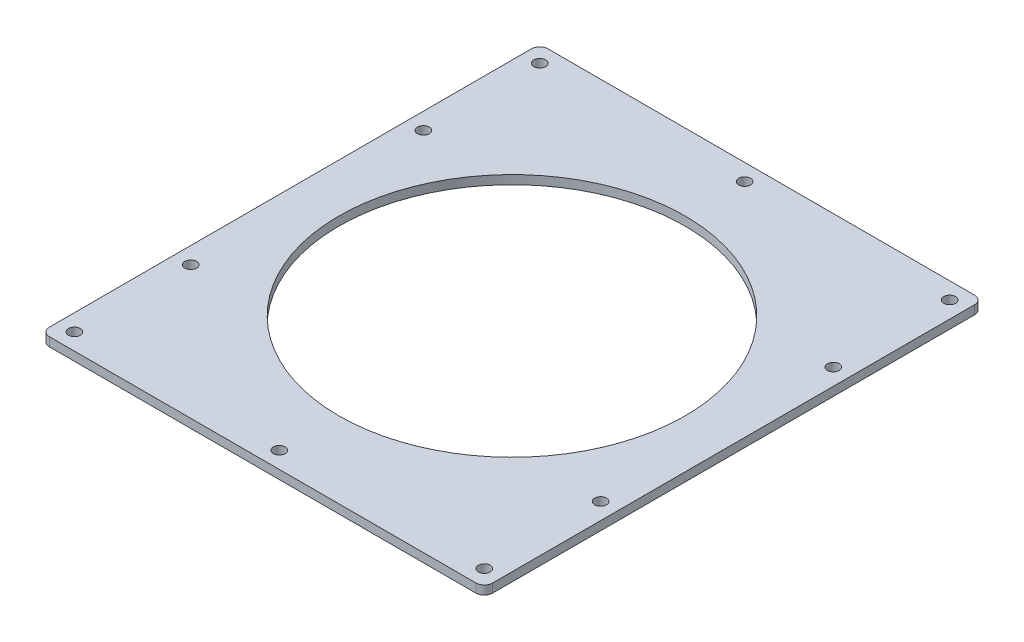
ISO-10303-21;
HEADER;
FILE_DESCRIPTION(('STEP AP214'),'2;1');
FILE_NAME('part.step','',(''),(''),'','','');
FILE_SCHEMA(('AUTOMOTIVE_DESIGN { 1 0 10303 214 1 1 1 1 }'));
ENDSEC;
DATA;
#1=APPLICATION_CONTEXT('core data for automotive mechanical design processes');
#2=APPLICATION_PROTOCOL_DEFINITION('international standard','automotive_design',2000,#1);
#3=PRODUCT_CONTEXT('',#1,'mechanical');
#4=PRODUCT('Part','Part','',(#3));
#5=PRODUCT_RELATED_PRODUCT_CATEGORY('part','',(#4));
#6=PRODUCT_DEFINITION_FORMATION('','',#4);
#7=PRODUCT_DEFINITION_CONTEXT('part definition',#1,'design');
#8=PRODUCT_DEFINITION('design','',#6,#7);
#9=PRODUCT_DEFINITION_SHAPE('','',#8);
#10=(LENGTH_UNIT() NAMED_UNIT(*) SI_UNIT(.MILLI.,.METRE.));
#11=(NAMED_UNIT(*) PLANE_ANGLE_UNIT() SI_UNIT($,.RADIAN.));
#12=(NAMED_UNIT(*) SI_UNIT($,.STERADIAN.) SOLID_ANGLE_UNIT());
#13=UNCERTAINTY_MEASURE_WITH_UNIT(LENGTH_MEASURE(1.E-05),#10,'distance_accuracy_value','');
#14=(GEOMETRIC_REPRESENTATION_CONTEXT(3) GLOBAL_UNCERTAINTY_ASSIGNED_CONTEXT((#13)) GLOBAL_UNIT_ASSIGNED_CONTEXT((#10,
#11,#12)) REPRESENTATION_CONTEXT('',''));
#15=CARTESIAN_POINT('',(0.,0.,0.));
#16=DIRECTION('',(0.,0.,1.));
#17=DIRECTION('',(1.,0.,0.));
#18=AXIS2_PLACEMENT_3D('',#15,#16,#17);
#19=CARTESIAN_POINT('',(0.,3.175,0.));
#20=DIRECTION('',(0.,-1.,0.));
#21=DIRECTION('',(0.,0.,-1.));
#22=AXIS2_PLACEMENT_3D('',#19,#20,#21);
#23=PLANE('',#22);
#24=DIRECTION('',(-1.,0.,0.));
#25=VECTOR('',#24,1.);
#26=CARTESIAN_POINT('',(-80.,3.175,-90.));
#27=LINE('',#26,#25);
#28=CARTESIAN_POINT('',(77.,3.175,-90.));
#29=VERTEX_POINT('',#28);
#30=CARTESIAN_POINT('',(-77.,3.175,-90.));
#31=VERTEX_POINT('',#30);
#32=EDGE_CURVE('E178',#29,#31,#27,.T.);
#33=ORIENTED_EDGE('',*,*,#32,.T.);
#34=CARTESIAN_POINT('',(-77.,3.175,-87.));
#35=DIRECTION('',(0.,-1.,0.));
#36=DIRECTION('',(0.,0.,-1.));
#37=AXIS2_PLACEMENT_3D('',#34,#35,#36);
#38=CIRCLE('',#37,3.);
#39=CARTESIAN_POINT('',(-80.,3.175,-86.9999999999999));
#40=VERTEX_POINT('',#39);
#41=EDGE_CURVE('E156',#31,#40,#38,.F.);
#42=ORIENTED_EDGE('',*,*,#41,.T.);
#43=DIRECTION('',(0.,0.,1.));
#44=VECTOR('',#43,1.);
#45=CARTESIAN_POINT('',(-80.,3.175,90.));
#46=LINE('',#45,#44);
#47=CARTESIAN_POINT('',(-80.,3.175,87.));
#48=VERTEX_POINT('',#47);
#49=EDGE_CURVE('E126',#40,#48,#46,.T.);
#50=ORIENTED_EDGE('',*,*,#49,.T.);
#51=CARTESIAN_POINT('',(-77.,3.175,87.));
#52=DIRECTION('',(0.,-1.,0.));
#53=DIRECTION('',(0.,0.,-1.));
#54=AXIS2_PLACEMENT_3D('',#51,#52,#53);
#55=CIRCLE('',#54,3.);
#56=CARTESIAN_POINT('',(-77.,3.175,90.));
#57=VERTEX_POINT('',#56);
#58=EDGE_CURVE('E62',#48,#57,#55,.F.);
#59=ORIENTED_EDGE('',*,*,#58,.T.);
#60=DIRECTION('',(1.,0.,0.));
#61=VECTOR('',#60,1.);
#62=CARTESIAN_POINT('',(-80.,3.175,90.));
#63=LINE('',#62,#61);
#64=CARTESIAN_POINT('',(77.,3.175,90.));
#65=VERTEX_POINT('',#64);
#66=EDGE_CURVE('E142',#57,#65,#63,.T.);
#67=ORIENTED_EDGE('',*,*,#66,.T.);
#68=CARTESIAN_POINT('',(77.,3.175,87.));
#69=DIRECTION('',(0.,-1.,0.));
#70=DIRECTION('',(0.,0.,-1.));
#71=AXIS2_PLACEMENT_3D('',#68,#69,#70);
#72=CIRCLE('',#71,3.);
#73=CARTESIAN_POINT('',(80.,3.175,87.));
#74=VERTEX_POINT('',#73);
#75=EDGE_CURVE('E154',#65,#74,#72,.F.);
#76=ORIENTED_EDGE('',*,*,#75,.T.);
#77=DIRECTION('',(0.,0.,-1.));
#78=VECTOR('',#77,1.);
#79=CARTESIAN_POINT('',(80.,3.175,90.));
#80=LINE('',#79,#78);
#81=CARTESIAN_POINT('',(80.,3.175,-86.9999999999999));
#82=VERTEX_POINT('',#81);
#83=EDGE_CURVE('E136',#74,#82,#80,.T.);
#84=ORIENTED_EDGE('',*,*,#83,.T.);
#85=CARTESIAN_POINT('',(77.,3.175,-87.));
#86=DIRECTION('',(0.,-1.,0.));
#87=DIRECTION('',(0.,0.,-1.));
#88=AXIS2_PLACEMENT_3D('',#85,#86,#87);
#89=CIRCLE('',#88,3.);
#90=EDGE_CURVE('E152',#82,#29,#89,.F.);
#91=ORIENTED_EDGE('',*,*,#90,.T.);
#92=EDGE_LOOP('',(#33,#42,#50,#59,#67,#76,#84,#91));
#93=FACE_BOUND('',#92,.T.);
#94=CARTESIAN_POINT('',(0.,3.175,0.));
#95=DIRECTION('',(0.,1.,0.));
#96=DIRECTION('',(0.,0.,1.));
#97=AXIS2_PLACEMENT_3D('',#94,#95,#96);
#98=CIRCLE('',#97,62.5);
#99=CARTESIAN_POINT('',(0.,3.175,62.5));
#100=VERTEX_POINT('',#99);
#101=EDGE_CURVE('E187',#100,#100,#98,.T.);
#102=ORIENTED_EDGE('',*,*,#101,.F.);
#103=EDGE_LOOP('',(#102));
#104=FACE_BOUND('',#103,.T.);
#105=CARTESIAN_POINT('',(74.,3.175,-42.));
#106=DIRECTION('',(0.,1.,0.));
#107=DIRECTION('',(0.,0.,1.));
#108=AXIS2_PLACEMENT_3D('',#105,#106,#107);
#109=CIRCLE('',#108,2.125);
#110=CARTESIAN_POINT('',(74.,3.175,-39.875));
#111=VERTEX_POINT('',#110);
#112=EDGE_CURVE('E192',#111,#111,#109,.T.);
#113=ORIENTED_EDGE('',*,*,#112,.F.);
#114=EDGE_LOOP('',(#113));
#115=FACE_BOUND('',#114,.T.);
#116=CARTESIAN_POINT('',(-74.,3.175,84.));
#117=DIRECTION('',(0.,1.,0.));
#118=DIRECTION('',(0.,0.,1.));
#119=AXIS2_PLACEMENT_3D('',#116,#117,#118);
#120=CIRCLE('',#119,2.125);
#121=CARTESIAN_POINT('',(-74.,3.175,86.125));
#122=VERTEX_POINT('',#121);
#123=EDGE_CURVE('E197',#122,#122,#120,.T.);
#124=ORIENTED_EDGE('',*,*,#123,.F.);
#125=EDGE_LOOP('',(#124));
#126=FACE_BOUND('',#125,.T.);
#127=CARTESIAN_POINT('',(-74.,3.175,-42.));
#128=DIRECTION('',(0.,1.,0.));
#129=DIRECTION('',(0.,0.,-1.));
#130=AXIS2_PLACEMENT_3D('',#127,#128,#129);
#131=CIRCLE('',#130,2.125);
#132=CARTESIAN_POINT('',(-74.,3.175,-44.125));
#133=VERTEX_POINT('',#132);
#134=EDGE_CURVE('E203',#133,#133,#131,.T.);
#135=ORIENTED_EDGE('',*,*,#134,.F.);
#136=EDGE_LOOP('',(#135));
#137=FACE_BOUND('',#136,.T.);
#138=CARTESIAN_POINT('',(-74.,3.175,42.));
#139=DIRECTION('',(0.,1.,0.));
#140=DIRECTION('',(0.,0.,1.));
#141=AXIS2_PLACEMENT_3D('',#138,#139,#140);
#142=CIRCLE('',#141,2.125);
#143=CARTESIAN_POINT('',(-74.,3.175,44.125));
#144=VERTEX_POINT('',#143);
#145=EDGE_CURVE('E209',#144,#144,#142,.T.);
#146=ORIENTED_EDGE('',*,*,#145,.F.);
#147=EDGE_LOOP('',(#146));
#148=FACE_BOUND('',#147,.T.);
#149=CARTESIAN_POINT('',(-74.,3.175,-84.));
#150=DIRECTION('',(0.,1.,0.));
#151=DIRECTION('',(0.,0.,-1.));
#152=AXIS2_PLACEMENT_3D('',#149,#150,#151);
#153=CIRCLE('',#152,2.125);
#154=CARTESIAN_POINT('',(-74.,3.175,-86.125));
#155=VERTEX_POINT('',#154);
#156=EDGE_CURVE('E215',#155,#155,#153,.T.);
#157=ORIENTED_EDGE('',*,*,#156,.F.);
#158=EDGE_LOOP('',(#157));
#159=FACE_BOUND('',#158,.T.);
#160=CARTESIAN_POINT('',(74.,3.175,84.));
#161=DIRECTION('',(0.,1.,0.));
#162=DIRECTION('',(0.,0.,-1.));
#163=AXIS2_PLACEMENT_3D('',#160,#161,#162);
#164=CIRCLE('',#163,2.125);
#165=CARTESIAN_POINT('',(74.,3.175,81.875));
#166=VERTEX_POINT('',#165);
#167=EDGE_CURVE('E221',#166,#166,#164,.T.);
#168=ORIENTED_EDGE('',*,*,#167,.F.);
#169=EDGE_LOOP('',(#168));
#170=FACE_BOUND('',#169,.T.);
#171=CARTESIAN_POINT('',(74.,3.175,42.));
#172=DIRECTION('',(0.,1.,0.));
#173=DIRECTION('',(0.,0.,-1.));
#174=AXIS2_PLACEMENT_3D('',#171,#172,#173);
#175=CIRCLE('',#174,2.125);
#176=CARTESIAN_POINT('',(74.,3.175,39.875));
#177=VERTEX_POINT('',#176);
#178=EDGE_CURVE('E227',#177,#177,#175,.T.);
#179=ORIENTED_EDGE('',*,*,#178,.F.);
#180=EDGE_LOOP('',(#179));
#181=FACE_BOUND('',#180,.T.);
#182=CARTESIAN_POINT('',(74.,3.175,-84.));
#183=DIRECTION('',(0.,1.,0.));
#184=DIRECTION('',(0.,0.,1.));
#185=AXIS2_PLACEMENT_3D('',#182,#183,#184);
#186=CIRCLE('',#185,2.125);
#187=CARTESIAN_POINT('',(74.,3.175,-81.875));
#188=VERTEX_POINT('',#187);
#189=EDGE_CURVE('E233',#188,#188,#186,.T.);
#190=ORIENTED_EDGE('',*,*,#189,.F.);
#191=EDGE_LOOP('',(#190));
#192=FACE_BOUND('',#191,.T.);
#193=CARTESIAN_POINT('',(0.,3.175,84.));
#194=DIRECTION('',(0.,1.,0.));
#195=DIRECTION('',(0.,0.,1.));
#196=AXIS2_PLACEMENT_3D('',#193,#194,#195);
#197=CIRCLE('',#196,2.125);
#198=CARTESIAN_POINT('',(0.,3.175,86.125));
#199=VERTEX_POINT('',#198);
#200=EDGE_CURVE('E239',#199,#199,#197,.T.);
#201=ORIENTED_EDGE('',*,*,#200,.F.);
#202=EDGE_LOOP('',(#201));
#203=FACE_BOUND('',#202,.T.);
#204=CARTESIAN_POINT('',(0.,3.175,-84.));
#205=DIRECTION('',(0.,1.,0.));
#206=DIRECTION('',(0.,0.,-1.));
#207=AXIS2_PLACEMENT_3D('',#204,#205,#206);
#208=CIRCLE('',#207,2.125);
#209=CARTESIAN_POINT('',(0.,3.175,-86.125));
#210=VERTEX_POINT('',#209);
#211=EDGE_CURVE('E245',#210,#210,#208,.T.);
#212=ORIENTED_EDGE('',*,*,#211,.F.);
#213=EDGE_LOOP('',(#212));
#214=FACE_BOUND('',#213,.T.);
#215=ADVANCED_FACE('F42',(#93,#104,#115,#126,#137,#148,#159,#170,#181,#192,#203,#214),#23,.F.);
#216=CARTESIAN_POINT('',(0.,0.,0.));
#217=DIRECTION('',(0.,-1.,0.));
#218=DIRECTION('',(0.,0.,-1.));
#219=AXIS2_PLACEMENT_3D('',#216,#217,#218);
#220=PLANE('',#219);
#221=CARTESIAN_POINT('',(0.,0.,84.));
#222=DIRECTION('',(0.,1.,0.));
#223=DIRECTION('',(0.,0.,1.));
#224=AXIS2_PLACEMENT_3D('',#221,#222,#223);
#225=CIRCLE('',#224,2.125);
#226=CARTESIAN_POINT('',(0.,0.,86.125));
#227=VERTEX_POINT('',#226);
#228=EDGE_CURVE('E242',#227,#227,#225,.T.);
#229=ORIENTED_EDGE('',*,*,#228,.T.);
#230=EDGE_LOOP('',(#229));
#231=FACE_BOUND('',#230,.T.);
#232=CARTESIAN_POINT('',(74.,0.,42.));
#233=DIRECTION('',(0.,1.,0.));
#234=DIRECTION('',(0.,0.,-1.));
#235=AXIS2_PLACEMENT_3D('',#232,#233,#234);
#236=CIRCLE('',#235,2.125);
#237=CARTESIAN_POINT('',(74.,0.,39.875));
#238=VERTEX_POINT('',#237);
#239=EDGE_CURVE('E230',#238,#238,#236,.T.);
#240=ORIENTED_EDGE('',*,*,#239,.T.);
#241=EDGE_LOOP('',(#240));
#242=FACE_BOUND('',#241,.T.);
#243=CARTESIAN_POINT('',(-74.,0.,-84.));
#244=DIRECTION('',(0.,1.,0.));
#245=DIRECTION('',(0.,0.,-1.));
#246=AXIS2_PLACEMENT_3D('',#243,#244,#245);
#247=CIRCLE('',#246,2.125);
#248=CARTESIAN_POINT('',(-74.,0.,-86.125));
#249=VERTEX_POINT('',#248);
#250=EDGE_CURVE('E218',#249,#249,#247,.T.);
#251=ORIENTED_EDGE('',*,*,#250,.T.);
#252=EDGE_LOOP('',(#251));
#253=FACE_BOUND('',#252,.T.);
#254=CARTESIAN_POINT('',(-74.,0.,-42.));
#255=DIRECTION('',(0.,1.,0.));
#256=DIRECTION('',(0.,0.,-1.));
#257=AXIS2_PLACEMENT_3D('',#254,#255,#256);
#258=CIRCLE('',#257,2.125);
#259=CARTESIAN_POINT('',(-74.,0.,-44.125));
#260=VERTEX_POINT('',#259);
#261=EDGE_CURVE('E206',#260,#260,#258,.T.);
#262=ORIENTED_EDGE('',*,*,#261,.T.);
#263=EDGE_LOOP('',(#262));
#264=FACE_BOUND('',#263,.T.);
#265=CARTESIAN_POINT('',(74.,0.,-42.));
#266=DIRECTION('',(0.,1.,0.));
#267=DIRECTION('',(0.,0.,1.));
#268=AXIS2_PLACEMENT_3D('',#265,#266,#267);
#269=CIRCLE('',#268,2.125);
#270=CARTESIAN_POINT('',(74.,0.,-39.875));
#271=VERTEX_POINT('',#270);
#272=EDGE_CURVE('E194',#271,#271,#269,.T.);
#273=ORIENTED_EDGE('',*,*,#272,.T.);
#274=EDGE_LOOP('',(#273));
#275=FACE_BOUND('',#274,.T.);
#276=DIRECTION('',(0.,0.,1.));
#277=VECTOR('',#276,1.);
#278=CARTESIAN_POINT('',(-80.,0.,90.));
#279=LINE('',#278,#277);
#280=CARTESIAN_POINT('',(-80.,0.,-86.9999999999999));
#281=VERTEX_POINT('',#280);
#282=CARTESIAN_POINT('',(-80.,0.,87.));
#283=VERTEX_POINT('',#282);
#284=EDGE_CURVE('E124',#281,#283,#279,.T.);
#285=ORIENTED_EDGE('',*,*,#284,.F.);
#286=CARTESIAN_POINT('',(-77.,0.,-87.));
#287=DIRECTION('',(0.,-1.,0.));
#288=DIRECTION('',(0.,0.,-1.));
#289=AXIS2_PLACEMENT_3D('',#286,#287,#288);
#290=CIRCLE('',#289,3.);
#291=CARTESIAN_POINT('',(-77.,0.,-90.));
#292=VERTEX_POINT('',#291);
#293=EDGE_CURVE('E107',#281,#292,#290,.T.);
#294=ORIENTED_EDGE('',*,*,#293,.T.);
#295=DIRECTION('',(-1.,0.,0.));
#296=VECTOR('',#295,1.);
#297=CARTESIAN_POINT('',(-80.,0.,-90.));
#298=LINE('',#297,#296);
#299=CARTESIAN_POINT('',(77.,0.,-90.));
#300=VERTEX_POINT('',#299);
#301=EDGE_CURVE('E134',#300,#292,#298,.T.);
#302=ORIENTED_EDGE('',*,*,#301,.F.);
#303=CARTESIAN_POINT('',(77.,0.,-87.));
#304=DIRECTION('',(0.,-1.,0.));
#305=DIRECTION('',(0.,0.,-1.));
#306=AXIS2_PLACEMENT_3D('',#303,#304,#305);
#307=CIRCLE('',#306,3.);
#308=CARTESIAN_POINT('',(80.,0.,-86.9999999999999));
#309=VERTEX_POINT('',#308);
#310=EDGE_CURVE('E145',#300,#309,#307,.T.);
#311=ORIENTED_EDGE('',*,*,#310,.T.);
#312=DIRECTION('',(0.,0.,-1.));
#313=VECTOR('',#312,1.);
#314=CARTESIAN_POINT('',(80.,0.,90.));
#315=LINE('',#314,#313);
#316=CARTESIAN_POINT('',(80.,0.,87.));
#317=VERTEX_POINT('',#316);
#318=EDGE_CURVE('E138',#317,#309,#315,.T.);
#319=ORIENTED_EDGE('',*,*,#318,.F.);
#320=CARTESIAN_POINT('',(77.,0.,87.));
#321=DIRECTION('',(0.,-1.,0.));
#322=DIRECTION('',(0.,0.,-1.));
#323=AXIS2_PLACEMENT_3D('',#320,#321,#322);
#324=CIRCLE('',#323,3.);
#325=CARTESIAN_POINT('',(77.,0.,90.));
#326=VERTEX_POINT('',#325);
#327=EDGE_CURVE('E118',#317,#326,#324,.T.);
#328=ORIENTED_EDGE('',*,*,#327,.T.);
#329=DIRECTION('',(1.,0.,0.));
#330=VECTOR('',#329,1.);
#331=CARTESIAN_POINT('',(-80.,0.,90.));
#332=LINE('',#331,#330);
#333=CARTESIAN_POINT('',(-77.,0.,90.));
#334=VERTEX_POINT('',#333);
#335=EDGE_CURVE('E133',#334,#326,#332,.T.);
#336=ORIENTED_EDGE('',*,*,#335,.F.);
#337=CARTESIAN_POINT('',(-77.,0.,87.));
#338=DIRECTION('',(0.,-1.,0.));
#339=DIRECTION('',(0.,0.,-1.));
#340=AXIS2_PLACEMENT_3D('',#337,#338,#339);
#341=CIRCLE('',#340,3.);
#342=EDGE_CURVE('E127',#334,#283,#341,.T.);
#343=ORIENTED_EDGE('',*,*,#342,.T.);
#344=EDGE_LOOP('',(#285,#294,#302,#311,#319,#328,#336,#343));
#345=FACE_BOUND('',#344,.T.);
#346=CARTESIAN_POINT('',(0.,0.,0.));
#347=DIRECTION('',(0.,1.,0.));
#348=DIRECTION('',(0.,0.,1.));
#349=AXIS2_PLACEMENT_3D('',#346,#347,#348);
#350=CIRCLE('',#349,62.5);
#351=CARTESIAN_POINT('',(0.,0.,62.5));
#352=VERTEX_POINT('',#351);
#353=EDGE_CURVE('E183',#352,#352,#350,.T.);
#354=ORIENTED_EDGE('',*,*,#353,.T.);
#355=EDGE_LOOP('',(#354));
#356=FACE_BOUND('',#355,.T.);
#357=CARTESIAN_POINT('',(-74.,0.,84.));
#358=DIRECTION('',(0.,1.,0.));
#359=DIRECTION('',(0.,0.,1.));
#360=AXIS2_PLACEMENT_3D('',#357,#358,#359);
#361=CIRCLE('',#360,2.125);
#362=CARTESIAN_POINT('',(-74.,0.,86.125));
#363=VERTEX_POINT('',#362);
#364=EDGE_CURVE('E200',#363,#363,#361,.T.);
#365=ORIENTED_EDGE('',*,*,#364,.T.);
#366=EDGE_LOOP('',(#365));
#367=FACE_BOUND('',#366,.T.);
#368=CARTESIAN_POINT('',(-74.,0.,42.));
#369=DIRECTION('',(0.,1.,0.));
#370=DIRECTION('',(0.,0.,1.));
#371=AXIS2_PLACEMENT_3D('',#368,#369,#370);
#372=CIRCLE('',#371,2.125);
#373=CARTESIAN_POINT('',(-74.,0.,44.125));
#374=VERTEX_POINT('',#373);
#375=EDGE_CURVE('E212',#374,#374,#372,.T.);
#376=ORIENTED_EDGE('',*,*,#375,.T.);
#377=EDGE_LOOP('',(#376));
#378=FACE_BOUND('',#377,.T.);
#379=CARTESIAN_POINT('',(74.,0.,84.));
#380=DIRECTION('',(0.,1.,0.));
#381=DIRECTION('',(0.,0.,-1.));
#382=AXIS2_PLACEMENT_3D('',#379,#380,#381);
#383=CIRCLE('',#382,2.125);
#384=CARTESIAN_POINT('',(74.,0.,81.875));
#385=VERTEX_POINT('',#384);
#386=EDGE_CURVE('E224',#385,#385,#383,.T.);
#387=ORIENTED_EDGE('',*,*,#386,.T.);
#388=EDGE_LOOP('',(#387));
#389=FACE_BOUND('',#388,.T.);
#390=CARTESIAN_POINT('',(74.,0.,-84.));
#391=DIRECTION('',(0.,1.,0.));
#392=DIRECTION('',(0.,0.,1.));
#393=AXIS2_PLACEMENT_3D('',#390,#391,#392);
#394=CIRCLE('',#393,2.125);
#395=CARTESIAN_POINT('',(74.,0.,-81.875));
#396=VERTEX_POINT('',#395);
#397=EDGE_CURVE('E236',#396,#396,#394,.T.);
#398=ORIENTED_EDGE('',*,*,#397,.T.);
#399=EDGE_LOOP('',(#398));
#400=FACE_BOUND('',#399,.T.);
#401=CARTESIAN_POINT('',(0.,0.,-84.));
#402=DIRECTION('',(0.,1.,0.));
#403=DIRECTION('',(0.,0.,-1.));
#404=AXIS2_PLACEMENT_3D('',#401,#402,#403);
#405=CIRCLE('',#404,2.125);
#406=CARTESIAN_POINT('',(0.,0.,-86.125));
#407=VERTEX_POINT('',#406);
#408=EDGE_CURVE('E248',#407,#407,#405,.T.);
#409=ORIENTED_EDGE('',*,*,#408,.T.);
#410=EDGE_LOOP('',(#409));
#411=FACE_BOUND('',#410,.T.);
#412=ADVANCED_FACE('F130',(#231,#242,#253,#264,#275,#345,#356,#367,#378,#389,#400,#411),#220,.T.);
#413=CARTESIAN_POINT('',(80.,3.175,90.));
#414=DIRECTION('',(-1.,0.,0.));
#415=DIRECTION('',(0.,0.,1.));
#416=AXIS2_PLACEMENT_3D('',#413,#414,#415);
#417=PLANE('',#416);
#418=ORIENTED_EDGE('',*,*,#83,.F.);
#419=DIRECTION('',(0.,-1.,0.));
#420=VECTOR('',#419,1.);
#421=CARTESIAN_POINT('',(80.,3.175,87.));
#422=LINE('',#421,#420);
#423=EDGE_CURVE('E160',#74,#317,#422,.T.);
#424=ORIENTED_EDGE('',*,*,#423,.T.);
#425=ORIENTED_EDGE('',*,*,#318,.T.);
#426=DIRECTION('',(0.,-1.,0.));
#427=VECTOR('',#426,1.);
#428=CARTESIAN_POINT('',(80.,3.175,-87.));
#429=LINE('',#428,#427);
#430=EDGE_CURVE('E158',#309,#82,#429,.F.);
#431=ORIENTED_EDGE('',*,*,#430,.T.);
#432=EDGE_LOOP('',(#418,#424,#425,#431));
#433=FACE_BOUND('',#432,.T.);
#434=ADVANCED_FACE('F174',(#433),#417,.F.);
#435=CARTESIAN_POINT('',(-80.,3.175,-90.));
#436=DIRECTION('',(0.,0.,1.));
#437=DIRECTION('',(1.,0.,0.));
#438=AXIS2_PLACEMENT_3D('',#435,#436,#437);
#439=PLANE('',#438);
#440=ORIENTED_EDGE('',*,*,#301,.T.);
#441=DIRECTION('',(0.,-1.,0.));
#442=VECTOR('',#441,1.);
#443=CARTESIAN_POINT('',(-77.,3.175,-90.));
#444=LINE('',#443,#442);
#445=EDGE_CURVE('E112',#292,#31,#444,.F.);
#446=ORIENTED_EDGE('',*,*,#445,.T.);
#447=ORIENTED_EDGE('',*,*,#32,.F.);
#448=DIRECTION('',(0.,-1.,0.));
#449=VECTOR('',#448,1.);
#450=CARTESIAN_POINT('',(77.,3.175,-90.));
#451=LINE('',#450,#449);
#452=EDGE_CURVE('E117',#29,#300,#451,.T.);
#453=ORIENTED_EDGE('',*,*,#452,.T.);
#454=EDGE_LOOP('',(#440,#446,#447,#453));
#455=FACE_BOUND('',#454,.T.);
#456=ADVANCED_FACE('F274',(#455),#439,.F.);
#457=CARTESIAN_POINT('',(-80.,3.175,90.));
#458=DIRECTION('',(1.,0.,0.));
#459=DIRECTION('',(0.,0.,-1.));
#460=AXIS2_PLACEMENT_3D('',#457,#458,#459);
#461=PLANE('',#460);
#462=ORIENTED_EDGE('',*,*,#49,.F.);
#463=DIRECTION('',(0.,-1.,0.));
#464=VECTOR('',#463,1.);
#465=CARTESIAN_POINT('',(-80.,3.175,-87.));
#466=LINE('',#465,#464);
#467=EDGE_CURVE('E111',#40,#281,#466,.T.);
#468=ORIENTED_EDGE('',*,*,#467,.T.);
#469=ORIENTED_EDGE('',*,*,#284,.T.);
#470=DIRECTION('',(0.,-1.,0.));
#471=VECTOR('',#470,1.);
#472=CARTESIAN_POINT('',(-80.,3.175,87.));
#473=LINE('',#472,#471);
#474=EDGE_CURVE('E128',#283,#48,#473,.F.);
#475=ORIENTED_EDGE('',*,*,#474,.T.);
#476=EDGE_LOOP('',(#462,#468,#469,#475));
#477=FACE_BOUND('',#476,.T.);
#478=ADVANCED_FACE('F123',(#477),#461,.F.);
#479=CARTESIAN_POINT('',(-80.,3.175,90.));
#480=DIRECTION('',(0.,0.,-1.));
#481=DIRECTION('',(-1.,0.,0.));
#482=AXIS2_PLACEMENT_3D('',#479,#480,#481);
#483=PLANE('',#482);
#484=ORIENTED_EDGE('',*,*,#335,.T.);
#485=DIRECTION('',(0.,-1.,0.));
#486=VECTOR('',#485,1.);
#487=CARTESIAN_POINT('',(77.,3.175,90.));
#488=LINE('',#487,#486);
#489=EDGE_CURVE('E11',#326,#65,#488,.F.);
#490=ORIENTED_EDGE('',*,*,#489,.T.);
#491=ORIENTED_EDGE('',*,*,#66,.F.);
#492=DIRECTION('',(0.,-1.,0.));
#493=VECTOR('',#492,1.);
#494=CARTESIAN_POINT('',(-77.,3.175,90.));
#495=LINE('',#494,#493);
#496=EDGE_CURVE('E50',#57,#334,#495,.T.);
#497=ORIENTED_EDGE('',*,*,#496,.T.);
#498=EDGE_LOOP('',(#484,#490,#491,#497));
#499=FACE_BOUND('',#498,.T.);
#500=ADVANCED_FACE('F164',(#499),#483,.F.);
#501=CARTESIAN_POINT('',(0.,3.175,0.));
#502=DIRECTION('',(0.,-1.,0.));
#503=DIRECTION('',(0.,0.,-1.));
#504=AXIS2_PLACEMENT_3D('',#501,#502,#503);
#505=CYLINDRICAL_SURFACE('',#504,62.5);
#506=ORIENTED_EDGE('',*,*,#101,.T.);
#507=EDGE_LOOP('',(#506));
#508=FACE_BOUND('',#507,.T.);
#509=ORIENTED_EDGE('',*,*,#353,.F.);
#510=EDGE_LOOP('',(#509));
#511=FACE_BOUND('',#510,.T.);
#512=ADVANCED_FACE('F267',(#508,#511),#505,.F.);
#513=CARTESIAN_POINT('',(74.,3.175,-42.));
#514=DIRECTION('',(0.,-1.,0.));
#515=DIRECTION('',(0.,0.,-1.));
#516=AXIS2_PLACEMENT_3D('',#513,#514,#515);
#517=CYLINDRICAL_SURFACE('',#516,2.125);
#518=ORIENTED_EDGE('',*,*,#112,.T.);
#519=EDGE_LOOP('',(#518));
#520=FACE_BOUND('',#519,.T.);
#521=ORIENTED_EDGE('',*,*,#272,.F.);
#522=EDGE_LOOP('',(#521));
#523=FACE_BOUND('',#522,.T.);
#524=ADVANCED_FACE('F397',(#520,#523),#517,.F.);
#525=CARTESIAN_POINT('',(-74.,3.175,84.));
#526=DIRECTION('',(0.,-1.,0.));
#527=DIRECTION('',(0.,0.,-1.));
#528=AXIS2_PLACEMENT_3D('',#525,#526,#527);
#529=CYLINDRICAL_SURFACE('',#528,2.125);
#530=ORIENTED_EDGE('',*,*,#123,.T.);
#531=EDGE_LOOP('',(#530));
#532=FACE_BOUND('',#531,.T.);
#533=ORIENTED_EDGE('',*,*,#364,.F.);
#534=EDGE_LOOP('',(#533));
#535=FACE_BOUND('',#534,.T.);
#536=ADVANCED_FACE('F387',(#532,#535),#529,.F.);
#537=CARTESIAN_POINT('',(-74.,3.175,-42.));
#538=DIRECTION('',(0.,-1.,0.));
#539=DIRECTION('',(0.,0.,-1.));
#540=AXIS2_PLACEMENT_3D('',#537,#538,#539);
#541=CYLINDRICAL_SURFACE('',#540,2.125);
#542=ORIENTED_EDGE('',*,*,#134,.T.);
#543=EDGE_LOOP('',(#542));
#544=FACE_BOUND('',#543,.T.);
#545=ORIENTED_EDGE('',*,*,#261,.F.);
#546=EDGE_LOOP('',(#545));
#547=FACE_BOUND('',#546,.T.);
#548=ADVANCED_FACE('F377',(#544,#547),#541,.F.);
#549=CARTESIAN_POINT('',(-74.,3.175,42.));
#550=DIRECTION('',(0.,-1.,0.));
#551=DIRECTION('',(0.,0.,-1.));
#552=AXIS2_PLACEMENT_3D('',#549,#550,#551);
#553=CYLINDRICAL_SURFACE('',#552,2.125);
#554=ORIENTED_EDGE('',*,*,#145,.T.);
#555=EDGE_LOOP('',(#554));
#556=FACE_BOUND('',#555,.T.);
#557=ORIENTED_EDGE('',*,*,#375,.F.);
#558=EDGE_LOOP('',(#557));
#559=FACE_BOUND('',#558,.T.);
#560=ADVANCED_FACE('F367',(#556,#559),#553,.F.);
#561=CARTESIAN_POINT('',(-74.,3.175,-84.));
#562=DIRECTION('',(0.,-1.,0.));
#563=DIRECTION('',(0.,0.,-1.));
#564=AXIS2_PLACEMENT_3D('',#561,#562,#563);
#565=CYLINDRICAL_SURFACE('',#564,2.125);
#566=ORIENTED_EDGE('',*,*,#156,.T.);
#567=EDGE_LOOP('',(#566));
#568=FACE_BOUND('',#567,.T.);
#569=ORIENTED_EDGE('',*,*,#250,.F.);
#570=EDGE_LOOP('',(#569));
#571=FACE_BOUND('',#570,.T.);
#572=ADVANCED_FACE('F357',(#568,#571),#565,.F.);
#573=CARTESIAN_POINT('',(74.,3.175,84.));
#574=DIRECTION('',(0.,-1.,0.));
#575=DIRECTION('',(0.,0.,-1.));
#576=AXIS2_PLACEMENT_3D('',#573,#574,#575);
#577=CYLINDRICAL_SURFACE('',#576,2.125);
#578=ORIENTED_EDGE('',*,*,#167,.T.);
#579=EDGE_LOOP('',(#578));
#580=FACE_BOUND('',#579,.T.);
#581=ORIENTED_EDGE('',*,*,#386,.F.);
#582=EDGE_LOOP('',(#581));
#583=FACE_BOUND('',#582,.T.);
#584=ADVANCED_FACE('F347',(#580,#583),#577,.F.);
#585=CARTESIAN_POINT('',(74.,3.175,42.));
#586=DIRECTION('',(0.,-1.,0.));
#587=DIRECTION('',(0.,0.,-1.));
#588=AXIS2_PLACEMENT_3D('',#585,#586,#587);
#589=CYLINDRICAL_SURFACE('',#588,2.125);
#590=ORIENTED_EDGE('',*,*,#178,.T.);
#591=EDGE_LOOP('',(#590));
#592=FACE_BOUND('',#591,.T.);
#593=ORIENTED_EDGE('',*,*,#239,.F.);
#594=EDGE_LOOP('',(#593));
#595=FACE_BOUND('',#594,.T.);
#596=ADVANCED_FACE('F337',(#592,#595),#589,.F.);
#597=CARTESIAN_POINT('',(74.,3.175,-84.));
#598=DIRECTION('',(0.,-1.,0.));
#599=DIRECTION('',(0.,0.,-1.));
#600=AXIS2_PLACEMENT_3D('',#597,#598,#599);
#601=CYLINDRICAL_SURFACE('',#600,2.125);
#602=ORIENTED_EDGE('',*,*,#189,.T.);
#603=EDGE_LOOP('',(#602));
#604=FACE_BOUND('',#603,.T.);
#605=ORIENTED_EDGE('',*,*,#397,.F.);
#606=EDGE_LOOP('',(#605));
#607=FACE_BOUND('',#606,.T.);
#608=ADVANCED_FACE('F327',(#604,#607),#601,.F.);
#609=CARTESIAN_POINT('',(0.,3.175,84.));
#610=DIRECTION('',(0.,-1.,0.));
#611=DIRECTION('',(0.,0.,-1.));
#612=AXIS2_PLACEMENT_3D('',#609,#610,#611);
#613=CYLINDRICAL_SURFACE('',#612,2.125);
#614=ORIENTED_EDGE('',*,*,#200,.T.);
#615=EDGE_LOOP('',(#614));
#616=FACE_BOUND('',#615,.T.);
#617=ORIENTED_EDGE('',*,*,#228,.F.);
#618=EDGE_LOOP('',(#617));
#619=FACE_BOUND('',#618,.T.);
#620=ADVANCED_FACE('F318',(#616,#619),#613,.F.);
#621=CARTESIAN_POINT('',(0.,3.175,-84.));
#622=DIRECTION('',(0.,-1.,0.));
#623=DIRECTION('',(0.,0.,-1.));
#624=AXIS2_PLACEMENT_3D('',#621,#622,#623);
#625=CYLINDRICAL_SURFACE('',#624,2.125);
#626=ORIENTED_EDGE('',*,*,#211,.T.);
#627=EDGE_LOOP('',(#626));
#628=FACE_BOUND('',#627,.T.);
#629=ORIENTED_EDGE('',*,*,#408,.F.);
#630=EDGE_LOOP('',(#629));
#631=FACE_BOUND('',#630,.T.);
#632=ADVANCED_FACE('F254',(#628,#631),#625,.F.);
#633=CARTESIAN_POINT('',(-77.,3.175,-87.));
#634=DIRECTION('',(0.,-1.,0.));
#635=DIRECTION('',(0.,0.,-1.));
#636=AXIS2_PLACEMENT_3D('',#633,#634,#635);
#637=CYLINDRICAL_SURFACE('',#636,3.);
#638=ORIENTED_EDGE('',*,*,#41,.F.);
#639=ORIENTED_EDGE('',*,*,#445,.F.);
#640=ORIENTED_EDGE('',*,*,#293,.F.);
#641=ORIENTED_EDGE('',*,*,#467,.F.);
#642=EDGE_LOOP('',(#638,#639,#640,#641));
#643=FACE_BOUND('',#642,.T.);
#644=ADVANCED_FACE('F110',(#643),#637,.T.);
#645=CARTESIAN_POINT('',(77.,3.175,87.));
#646=DIRECTION('',(0.,-1.,0.));
#647=DIRECTION('',(0.,0.,-1.));
#648=AXIS2_PLACEMENT_3D('',#645,#646,#647);
#649=CYLINDRICAL_SURFACE('',#648,3.);
#650=ORIENTED_EDGE('',*,*,#75,.F.);
#651=ORIENTED_EDGE('',*,*,#489,.F.);
#652=ORIENTED_EDGE('',*,*,#327,.F.);
#653=ORIENTED_EDGE('',*,*,#423,.F.);
#654=EDGE_LOOP('',(#650,#651,#652,#653));
#655=FACE_BOUND('',#654,.T.);
#656=ADVANCED_FACE('F171',(#655),#649,.T.);
#657=CARTESIAN_POINT('',(77.,3.175,-87.));
#658=DIRECTION('',(0.,-1.,0.));
#659=DIRECTION('',(0.,0.,-1.));
#660=AXIS2_PLACEMENT_3D('',#657,#658,#659);
#661=CYLINDRICAL_SURFACE('',#660,3.);
#662=ORIENTED_EDGE('',*,*,#90,.F.);
#663=ORIENTED_EDGE('',*,*,#430,.F.);
#664=ORIENTED_EDGE('',*,*,#310,.F.);
#665=ORIENTED_EDGE('',*,*,#452,.F.);
#666=EDGE_LOOP('',(#662,#663,#664,#665));
#667=FACE_BOUND('',#666,.T.);
#668=ADVANCED_FACE('F283',(#667),#661,.T.);
#669=CARTESIAN_POINT('',(-77.,3.175,87.));
#670=DIRECTION('',(0.,-1.,0.));
#671=DIRECTION('',(0.,0.,-1.));
#672=AXIS2_PLACEMENT_3D('',#669,#670,#671);
#673=CYLINDRICAL_SURFACE('',#672,3.);
#674=ORIENTED_EDGE('',*,*,#58,.F.);
#675=ORIENTED_EDGE('',*,*,#474,.F.);
#676=ORIENTED_EDGE('',*,*,#342,.F.);
#677=ORIENTED_EDGE('',*,*,#496,.F.);
#678=EDGE_LOOP('',(#674,#675,#676,#677));
#679=FACE_BOUND('',#678,.T.);
#680=ADVANCED_FACE('F44',(#679),#673,.T.);
#681=CLOSED_SHELL('',(#215,#412,#434,#456,#478,#500,#512,#524,#536,#548,#560,#572,#584,#596,
#608,#620,#632,#644,#656,#668,#680));
#682=MANIFOLD_SOLID_BREP('B2',#681);
#683=ADVANCED_BREP_SHAPE_REPRESENTATION('',(#18,#682),#14);
#684=SHAPE_DEFINITION_REPRESENTATION(#9,#683);
ENDSEC;
END-ISO-10303-21;
